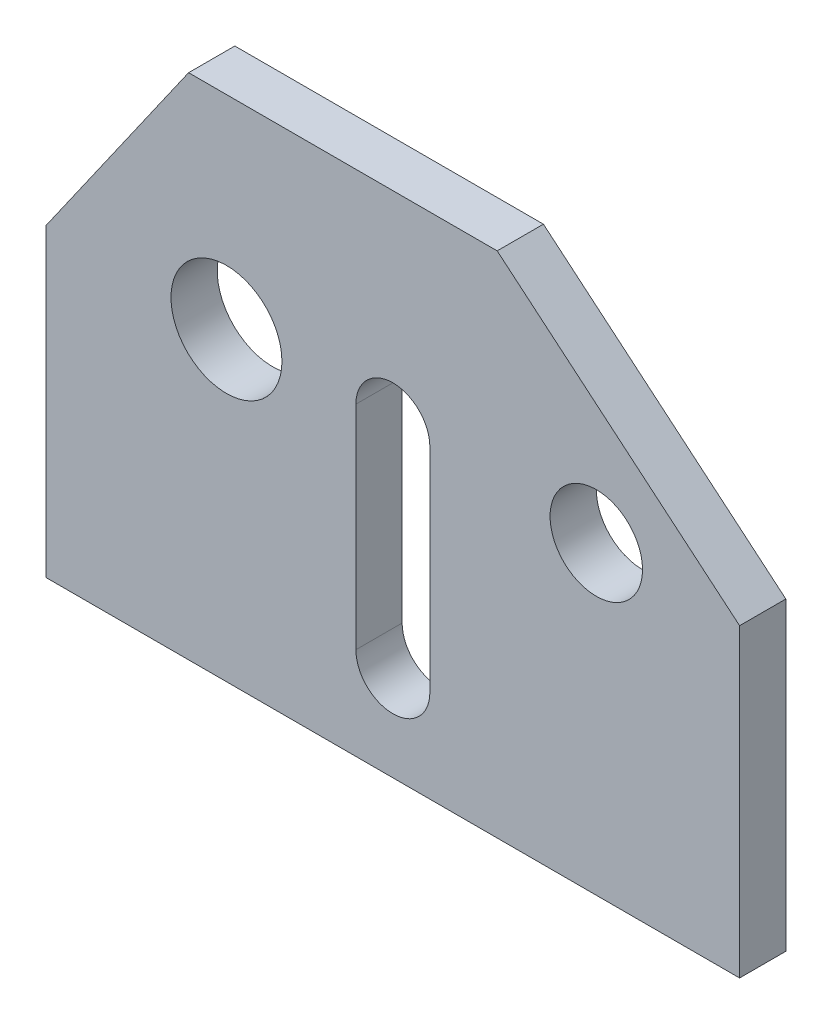
ISO-10303-21;
HEADER;
FILE_DESCRIPTION(('STEP AP214'),'2;1');
FILE_NAME('part.step','',(''),(''),'','','');
FILE_SCHEMA(('AUTOMOTIVE_DESIGN { 1 0 10303 214 1 1 1 1 }'));
ENDSEC;
DATA;
#1=APPLICATION_CONTEXT('core data for automotive mechanical design processes');
#2=APPLICATION_PROTOCOL_DEFINITION('international standard','automotive_design',2000,#1);
#3=PRODUCT_CONTEXT('',#1,'mechanical');
#4=PRODUCT('Part','Part','',(#3));
#5=PRODUCT_RELATED_PRODUCT_CATEGORY('part','',(#4));
#6=PRODUCT_DEFINITION_FORMATION('','',#4);
#7=PRODUCT_DEFINITION_CONTEXT('part definition',#1,'design');
#8=PRODUCT_DEFINITION('design','',#6,#7);
#9=PRODUCT_DEFINITION_SHAPE('','',#8);
#10=(LENGTH_UNIT() NAMED_UNIT(*) SI_UNIT(.MILLI.,.METRE.));
#11=(NAMED_UNIT(*) PLANE_ANGLE_UNIT() SI_UNIT($,.RADIAN.));
#12=(NAMED_UNIT(*) SI_UNIT($,.STERADIAN.) SOLID_ANGLE_UNIT());
#13=UNCERTAINTY_MEASURE_WITH_UNIT(LENGTH_MEASURE(1.E-05),#10,'distance_accuracy_value','');
#14=(GEOMETRIC_REPRESENTATION_CONTEXT(3) GLOBAL_UNCERTAINTY_ASSIGNED_CONTEXT((#13)) GLOBAL_UNIT_ASSIGNED_CONTEXT((#10,
#11,#12)) REPRESENTATION_CONTEXT('',''));
#15=CARTESIAN_POINT('',(0.,0.,0.));
#16=DIRECTION('',(0.,0.,1.));
#17=DIRECTION('',(1.,0.,0.));
#18=AXIS2_PLACEMENT_3D('',#15,#16,#17);
#19=CARTESIAN_POINT('',(0.,0.,5.));
#20=DIRECTION('',(0.,0.,1.));
#21=DIRECTION('',(1.,0.,0.));
#22=AXIS2_PLACEMENT_3D('',#19,#20,#21);
#23=PLANE('',#22);
#24=CARTESIAN_POINT('',(19.5,33.,5.));
#25=DIRECTION('',(0.,0.,1.));
#26=DIRECTION('',(1.,0.,0.));
#27=AXIS2_PLACEMENT_3D('',#24,#25,#26);
#28=CIRCLE('',#27,6.);
#29=CARTESIAN_POINT('',(25.5,33.,5.));
#30=VERTEX_POINT('',#29);
#31=EDGE_CURVE('E149',#30,#30,#28,.T.);
#32=ORIENTED_EDGE('',*,*,#31,.F.);
#33=EDGE_LOOP('',(#32));
#34=FACE_BOUND('',#33,.T.);
#35=DIRECTION('',(0.,-1.,0.));
#36=VECTOR('',#35,1.);
#37=CARTESIAN_POINT('',(0.,33.,5.));
#38=LINE('',#37,#36);
#39=CARTESIAN_POINT('',(0.,33.,5.));
#40=VERTEX_POINT('',#39);
#41=CARTESIAN_POINT('',(0.,0.,5.));
#42=VERTEX_POINT('',#41);
#43=EDGE_CURVE('E159',#40,#42,#38,.T.);
#44=ORIENTED_EDGE('',*,*,#43,.T.);
#45=DIRECTION('',(1.,0.,0.));
#46=VECTOR('',#45,1.);
#47=CARTESIAN_POINT('',(0.,0.,5.));
#48=LINE('',#47,#46);
#49=CARTESIAN_POINT('',(75.,0.,5.));
#50=VERTEX_POINT('',#49);
#51=EDGE_CURVE('E162',#42,#50,#48,.T.);
#52=ORIENTED_EDGE('',*,*,#51,.T.);
#53=DIRECTION('',(0.,1.,0.));
#54=VECTOR('',#53,1.);
#55=CARTESIAN_POINT('',(75.,0.,5.));
#56=LINE('',#55,#54);
#57=CARTESIAN_POINT('',(75.,33.,5.));
#58=VERTEX_POINT('',#57);
#59=EDGE_CURVE('E165',#50,#58,#56,.T.);
#60=ORIENTED_EDGE('',*,*,#59,.T.);
#61=DIRECTION('',(-0.766044443118979,0.642787609686538,0.));
#62=VECTOR('',#61,1.);
#63=CARTESIAN_POINT('',(75.,33.,5.));
#64=LINE('',#63,#62);
#65=CARTESIAN_POINT('',(48.7814209629273,55.,5.));
#66=VERTEX_POINT('',#65);
#67=EDGE_CURVE('E167',#58,#66,#64,.T.);
#68=ORIENTED_EDGE('',*,*,#67,.T.);
#69=DIRECTION('',(-1.,0.,0.));
#70=VECTOR('',#69,1.);
#71=CARTESIAN_POINT('',(48.7814209629273,55.,5.));
#72=LINE('',#71,#70);
#73=CARTESIAN_POINT('',(15.4045658406134,55.,5.));
#74=VERTEX_POINT('',#73);
#75=EDGE_CURVE('E169',#66,#74,#72,.T.);
#76=ORIENTED_EDGE('',*,*,#75,.T.);
#77=DIRECTION('',(-0.573576436351041,-0.819152044288995,0.));
#78=VECTOR('',#77,1.);
#79=CARTESIAN_POINT('',(15.4045658406134,55.,5.));
#80=LINE('',#79,#78);
#81=EDGE_CURVE('E171',#74,#40,#80,.T.);
#82=ORIENTED_EDGE('',*,*,#81,.T.);
#83=EDGE_LOOP('',(#44,#52,#60,#68,#76,#82));
#84=FACE_BOUND('',#83,.T.);
#85=DIRECTION('',(0.,-1.,0.));
#86=VECTOR('',#85,1.);
#87=CARTESIAN_POINT('',(33.5,33.,5.));
#88=LINE('',#87,#86);
#89=CARTESIAN_POINT('',(33.5,33.,5.));
#90=VERTEX_POINT('',#89);
#91=CARTESIAN_POINT('',(33.5,10.,5.));
#92=VERTEX_POINT('',#91);
#93=EDGE_CURVE('E128',#90,#92,#88,.T.);
#94=ORIENTED_EDGE('',*,*,#93,.F.);
#95=CARTESIAN_POINT('',(37.5,33.,5.));
#96=DIRECTION('',(0.,0.,1.));
#97=DIRECTION('',(1.,0.,0.));
#98=AXIS2_PLACEMENT_3D('',#95,#96,#97);
#99=CIRCLE('',#98,4.);
#100=CARTESIAN_POINT('',(41.5,33.,5.));
#101=VERTEX_POINT('',#100);
#102=EDGE_CURVE('E120',#101,#90,#99,.T.);
#103=ORIENTED_EDGE('',*,*,#102,.F.);
#104=DIRECTION('',(0.,1.,0.));
#105=VECTOR('',#104,1.);
#106=CARTESIAN_POINT('',(41.5,10.,5.));
#107=LINE('',#106,#105);
#108=CARTESIAN_POINT('',(41.5,10.,5.));
#109=VERTEX_POINT('',#108);
#110=EDGE_CURVE('E143',#109,#101,#107,.T.);
#111=ORIENTED_EDGE('',*,*,#110,.F.);
#112=CARTESIAN_POINT('',(37.5,10.,5.));
#113=DIRECTION('',(0.,0.,1.));
#114=DIRECTION('',(1.,0.,0.));
#115=AXIS2_PLACEMENT_3D('',#112,#113,#114);
#116=CIRCLE('',#115,4.);
#117=EDGE_CURVE('E141',#92,#109,#116,.T.);
#118=ORIENTED_EDGE('',*,*,#117,.F.);
#119=EDGE_LOOP('',(#94,#103,#111,#118));
#120=FACE_BOUND('',#119,.T.);
#121=CARTESIAN_POINT('',(59.5,33.,5.));
#122=DIRECTION('',(0.,0.,1.));
#123=DIRECTION('',(1.,0.,0.));
#124=AXIS2_PLACEMENT_3D('',#121,#122,#123);
#125=CIRCLE('',#124,4.99999999999998);
#126=CARTESIAN_POINT('',(64.5,33.,5.));
#127=VERTEX_POINT('',#126);
#128=EDGE_CURVE('E265',#127,#127,#125,.T.);
#129=ORIENTED_EDGE('',*,*,#128,.F.);
#130=EDGE_LOOP('',(#129));
#131=FACE_BOUND('',#130,.T.);
#132=ADVANCED_FACE('F43',(#34,#84,#120,#131),#23,.T.);
#133=CARTESIAN_POINT('',(0.,0.,0.));
#134=DIRECTION('',(0.,0.,1.));
#135=DIRECTION('',(1.,0.,0.));
#136=AXIS2_PLACEMENT_3D('',#133,#134,#135);
#137=PLANE('',#136);
#138=DIRECTION('',(0.,-1.,0.));
#139=VECTOR('',#138,1.);
#140=CARTESIAN_POINT('',(0.,33.,0.));
#141=LINE('',#140,#139);
#142=CARTESIAN_POINT('',(0.,33.,0.));
#143=VERTEX_POINT('',#142);
#144=CARTESIAN_POINT('',(0.,0.,0.));
#145=VERTEX_POINT('',#144);
#146=EDGE_CURVE('E136',#143,#145,#141,.T.);
#147=ORIENTED_EDGE('',*,*,#146,.F.);
#148=DIRECTION('',(-0.573576436351041,-0.819152044288995,0.));
#149=VECTOR('',#148,1.);
#150=CARTESIAN_POINT('',(15.4045658406134,55.,0.));
#151=LINE('',#150,#149);
#152=CARTESIAN_POINT('',(15.4045658406134,55.,0.));
#153=VERTEX_POINT('',#152);
#154=EDGE_CURVE('E163',#153,#143,#151,.T.);
#155=ORIENTED_EDGE('',*,*,#154,.F.);
#156=DIRECTION('',(-1.,0.,0.));
#157=VECTOR('',#156,1.);
#158=CARTESIAN_POINT('',(48.7814209629273,55.,0.));
#159=LINE('',#158,#157);
#160=CARTESIAN_POINT('',(48.7814209629273,55.,0.));
#161=VERTEX_POINT('',#160);
#162=EDGE_CURVE('E182',#161,#153,#159,.T.);
#163=ORIENTED_EDGE('',*,*,#162,.F.);
#164=DIRECTION('',(-0.766044443118979,0.642787609686538,0.));
#165=VECTOR('',#164,1.);
#166=CARTESIAN_POINT('',(75.,33.,0.));
#167=LINE('',#166,#165);
#168=CARTESIAN_POINT('',(75.,33.,0.));
#169=VERTEX_POINT('',#168);
#170=EDGE_CURVE('E180',#169,#161,#167,.T.);
#171=ORIENTED_EDGE('',*,*,#170,.F.);
#172=DIRECTION('',(0.,1.,0.));
#173=VECTOR('',#172,1.);
#174=CARTESIAN_POINT('',(75.,0.,0.));
#175=LINE('',#174,#173);
#176=CARTESIAN_POINT('',(75.,0.,0.));
#177=VERTEX_POINT('',#176);
#178=EDGE_CURVE('E178',#177,#169,#175,.T.);
#179=ORIENTED_EDGE('',*,*,#178,.F.);
#180=DIRECTION('',(1.,0.,0.));
#181=VECTOR('',#180,1.);
#182=CARTESIAN_POINT('',(0.,0.,0.));
#183=LINE('',#182,#181);
#184=EDGE_CURVE('E176',#145,#177,#183,.T.);
#185=ORIENTED_EDGE('',*,*,#184,.F.);
#186=EDGE_LOOP('',(#147,#155,#163,#171,#179,#185));
#187=FACE_BOUND('',#186,.T.);
#188=CARTESIAN_POINT('',(37.5,33.,0.));
#189=DIRECTION('',(0.,0.,1.));
#190=DIRECTION('',(1.,0.,0.));
#191=AXIS2_PLACEMENT_3D('',#188,#189,#190);
#192=CIRCLE('',#191,4.);
#193=CARTESIAN_POINT('',(41.5,33.,0.));
#194=VERTEX_POINT('',#193);
#195=CARTESIAN_POINT('',(33.5,33.,0.));
#196=VERTEX_POINT('',#195);
#197=EDGE_CURVE('E66',#194,#196,#192,.T.);
#198=ORIENTED_EDGE('',*,*,#197,.T.);
#199=DIRECTION('',(0.,-1.,0.));
#200=VECTOR('',#199,1.);
#201=CARTESIAN_POINT('',(33.5,33.,0.));
#202=LINE('',#201,#200);
#203=CARTESIAN_POINT('',(33.5,10.,0.));
#204=VERTEX_POINT('',#203);
#205=EDGE_CURVE('E135',#196,#204,#202,.T.);
#206=ORIENTED_EDGE('',*,*,#205,.T.);
#207=CARTESIAN_POINT('',(37.5,10.,0.));
#208=DIRECTION('',(0.,0.,1.));
#209=DIRECTION('',(1.,0.,0.));
#210=AXIS2_PLACEMENT_3D('',#207,#208,#209);
#211=CIRCLE('',#210,4.);
#212=CARTESIAN_POINT('',(41.5,10.,0.));
#213=VERTEX_POINT('',#212);
#214=EDGE_CURVE('E151',#204,#213,#211,.T.);
#215=ORIENTED_EDGE('',*,*,#214,.T.);
#216=DIRECTION('',(0.,1.,0.));
#217=VECTOR('',#216,1.);
#218=CARTESIAN_POINT('',(41.5,10.,0.));
#219=LINE('',#218,#217);
#220=EDGE_CURVE('E129',#213,#194,#219,.T.);
#221=ORIENTED_EDGE('',*,*,#220,.T.);
#222=EDGE_LOOP('',(#198,#206,#215,#221));
#223=FACE_BOUND('',#222,.T.);
#224=CARTESIAN_POINT('',(19.5,33.,0.));
#225=DIRECTION('',(0.,0.,1.));
#226=DIRECTION('',(1.,0.,0.));
#227=AXIS2_PLACEMENT_3D('',#224,#225,#226);
#228=CIRCLE('',#227,6.);
#229=CARTESIAN_POINT('',(25.5,33.,0.));
#230=VERTEX_POINT('',#229);
#231=EDGE_CURVE('E271',#230,#230,#228,.T.);
#232=ORIENTED_EDGE('',*,*,#231,.T.);
#233=EDGE_LOOP('',(#232));
#234=FACE_BOUND('',#233,.T.);
#235=CARTESIAN_POINT('',(59.5,33.,0.));
#236=DIRECTION('',(0.,0.,1.));
#237=DIRECTION('',(1.,0.,0.));
#238=AXIS2_PLACEMENT_3D('',#235,#236,#237);
#239=CIRCLE('',#238,4.99999999999998);
#240=CARTESIAN_POINT('',(64.5,33.,0.));
#241=VERTEX_POINT('',#240);
#242=EDGE_CURVE('E268',#241,#241,#239,.T.);
#243=ORIENTED_EDGE('',*,*,#242,.T.);
#244=EDGE_LOOP('',(#243));
#245=FACE_BOUND('',#244,.T.);
#246=ADVANCED_FACE('F206',(#187,#223,#234,#245),#137,.F.);
#247=CARTESIAN_POINT('',(0.,33.,5.));
#248=DIRECTION('',(1.,0.,0.));
#249=DIRECTION('',(0.,0.,-1.));
#250=AXIS2_PLACEMENT_3D('',#247,#248,#249);
#251=PLANE('',#250);
#252=ORIENTED_EDGE('',*,*,#146,.T.);
#253=DIRECTION('',(0.,0.,-1.));
#254=VECTOR('',#253,1.);
#255=CARTESIAN_POINT('',(0.,0.,5.));
#256=LINE('',#255,#254);
#257=EDGE_CURVE('E11',#42,#145,#256,.T.);
#258=ORIENTED_EDGE('',*,*,#257,.F.);
#259=ORIENTED_EDGE('',*,*,#43,.F.);
#260=DIRECTION('',(0.,0.,-1.));
#261=VECTOR('',#260,1.);
#262=CARTESIAN_POINT('',(0.,33.,5.));
#263=LINE('',#262,#261);
#264=EDGE_CURVE('E173',#40,#143,#263,.T.);
#265=ORIENTED_EDGE('',*,*,#264,.T.);
#266=EDGE_LOOP('',(#252,#258,#259,#265));
#267=FACE_BOUND('',#266,.T.);
#268=ADVANCED_FACE('F45',(#267),#251,.F.);
#269=CARTESIAN_POINT('',(0.,0.,5.));
#270=DIRECTION('',(0.,1.,0.));
#271=DIRECTION('',(0.,0.,1.));
#272=AXIS2_PLACEMENT_3D('',#269,#270,#271);
#273=PLANE('',#272);
#274=ORIENTED_EDGE('',*,*,#184,.T.);
#275=DIRECTION('',(0.,0.,-1.));
#276=VECTOR('',#275,1.);
#277=CARTESIAN_POINT('',(75.,0.,5.));
#278=LINE('',#277,#276);
#279=EDGE_CURVE('E51',#50,#177,#278,.T.);
#280=ORIENTED_EDGE('',*,*,#279,.F.);
#281=ORIENTED_EDGE('',*,*,#51,.F.);
#282=ORIENTED_EDGE('',*,*,#257,.T.);
#283=EDGE_LOOP('',(#274,#280,#281,#282));
#284=FACE_BOUND('',#283,.T.);
#285=ADVANCED_FACE('F223',(#284),#273,.F.);
#286=CARTESIAN_POINT('',(75.,0.,5.));
#287=DIRECTION('',(-1.,0.,0.));
#288=DIRECTION('',(0.,0.,1.));
#289=AXIS2_PLACEMENT_3D('',#286,#287,#288);
#290=PLANE('',#289);
#291=ORIENTED_EDGE('',*,*,#178,.T.);
#292=DIRECTION('',(0.,0.,-1.));
#293=VECTOR('',#292,1.);
#294=CARTESIAN_POINT('',(75.,33.,5.));
#295=LINE('',#294,#293);
#296=EDGE_CURVE('E193',#58,#169,#295,.T.);
#297=ORIENTED_EDGE('',*,*,#296,.F.);
#298=ORIENTED_EDGE('',*,*,#59,.F.);
#299=ORIENTED_EDGE('',*,*,#279,.T.);
#300=EDGE_LOOP('',(#291,#297,#298,#299));
#301=FACE_BOUND('',#300,.T.);
#302=ADVANCED_FACE('F200',(#301),#290,.F.);
#303=CARTESIAN_POINT('',(75.,33.,5.));
#304=DIRECTION('',(-0.642787609686538,-0.766044443118979,0.));
#305=DIRECTION('',(0.766044443118979,-0.642787609686538,0.));
#306=AXIS2_PLACEMENT_3D('',#303,#304,#305);
#307=PLANE('',#306);
#308=ORIENTED_EDGE('',*,*,#170,.T.);
#309=DIRECTION('',(0.,0.,-1.));
#310=VECTOR('',#309,1.);
#311=CARTESIAN_POINT('',(48.7814209629273,55.,5.));
#312=LINE('',#311,#310);
#313=EDGE_CURVE('E190',#66,#161,#312,.T.);
#314=ORIENTED_EDGE('',*,*,#313,.F.);
#315=ORIENTED_EDGE('',*,*,#67,.F.);
#316=ORIENTED_EDGE('',*,*,#296,.T.);
#317=EDGE_LOOP('',(#308,#314,#315,#316));
#318=FACE_BOUND('',#317,.T.);
#319=ADVANCED_FACE('F212',(#318),#307,.F.);
#320=CARTESIAN_POINT('',(48.7814209629273,55.,5.));
#321=DIRECTION('',(0.,-1.,0.));
#322=DIRECTION('',(1.,0.,0.));
#323=AXIS2_PLACEMENT_3D('',#320,#321,#322);
#324=PLANE('',#323);
#325=ORIENTED_EDGE('',*,*,#162,.T.);
#326=DIRECTION('',(0.,0.,-1.));
#327=VECTOR('',#326,1.);
#328=CARTESIAN_POINT('',(15.4045658406134,55.,5.));
#329=LINE('',#328,#327);
#330=EDGE_CURVE('E187',#74,#153,#329,.T.);
#331=ORIENTED_EDGE('',*,*,#330,.F.);
#332=ORIENTED_EDGE('',*,*,#75,.F.);
#333=ORIENTED_EDGE('',*,*,#313,.T.);
#334=EDGE_LOOP('',(#325,#331,#332,#333));
#335=FACE_BOUND('',#334,.T.);
#336=ADVANCED_FACE('F216',(#335),#324,.F.);
#337=CARTESIAN_POINT('',(15.4045658406134,55.,5.));
#338=DIRECTION('',(0.819152044288995,-0.573576436351041,0.));
#339=DIRECTION('',(0.573576436351041,0.819152044288995,0.));
#340=AXIS2_PLACEMENT_3D('',#337,#338,#339);
#341=PLANE('',#340);
#342=ORIENTED_EDGE('',*,*,#154,.T.);
#343=ORIENTED_EDGE('',*,*,#264,.F.);
#344=ORIENTED_EDGE('',*,*,#81,.F.);
#345=ORIENTED_EDGE('',*,*,#330,.T.);
#346=EDGE_LOOP('',(#342,#343,#344,#345));
#347=FACE_BOUND('',#346,.T.);
#348=ADVANCED_FACE('F226',(#347),#341,.F.);
#349=CARTESIAN_POINT('',(37.5,33.,5.));
#350=DIRECTION('',(0.,0.,-1.));
#351=DIRECTION('',(-1.,0.,0.));
#352=AXIS2_PLACEMENT_3D('',#349,#350,#351);
#353=CYLINDRICAL_SURFACE('',#352,4.);
#354=ORIENTED_EDGE('',*,*,#197,.F.);
#355=DIRECTION('',(0.,0.,-1.));
#356=VECTOR('',#355,1.);
#357=CARTESIAN_POINT('',(41.5,33.,5.));
#358=LINE('',#357,#356);
#359=EDGE_CURVE('E124',#101,#194,#358,.T.);
#360=ORIENTED_EDGE('',*,*,#359,.F.);
#361=ORIENTED_EDGE('',*,*,#102,.T.);
#362=DIRECTION('',(0.,0.,-1.));
#363=VECTOR('',#362,1.);
#364=CARTESIAN_POINT('',(33.5,33.,5.));
#365=LINE('',#364,#363);
#366=EDGE_CURVE('E123',#90,#196,#365,.T.);
#367=ORIENTED_EDGE('',*,*,#366,.T.);
#368=EDGE_LOOP('',(#354,#360,#361,#367));
#369=FACE_BOUND('',#368,.T.);
#370=ADVANCED_FACE('F122',(#369),#353,.F.);
#371=CARTESIAN_POINT('',(33.5,33.,5.));
#372=DIRECTION('',(1.,0.,0.));
#373=DIRECTION('',(0.,1.,0.));
#374=AXIS2_PLACEMENT_3D('',#371,#372,#373);
#375=PLANE('',#374);
#376=ORIENTED_EDGE('',*,*,#205,.F.);
#377=ORIENTED_EDGE('',*,*,#366,.F.);
#378=ORIENTED_EDGE('',*,*,#93,.T.);
#379=DIRECTION('',(0.,0.,-1.));
#380=VECTOR('',#379,1.);
#381=CARTESIAN_POINT('',(33.5,10.,5.));
#382=LINE('',#381,#380);
#383=EDGE_CURVE('E137',#92,#204,#382,.T.);
#384=ORIENTED_EDGE('',*,*,#383,.T.);
#385=EDGE_LOOP('',(#376,#377,#378,#384));
#386=FACE_BOUND('',#385,.T.);
#387=ADVANCED_FACE('F132',(#386),#375,.T.);
#388=CARTESIAN_POINT('',(37.5,10.,5.));
#389=DIRECTION('',(0.,0.,-1.));
#390=DIRECTION('',(-1.,0.,0.));
#391=AXIS2_PLACEMENT_3D('',#388,#389,#390);
#392=CYLINDRICAL_SURFACE('',#391,4.);
#393=ORIENTED_EDGE('',*,*,#214,.F.);
#394=ORIENTED_EDGE('',*,*,#383,.F.);
#395=ORIENTED_EDGE('',*,*,#117,.T.);
#396=DIRECTION('',(0.,0.,-1.));
#397=VECTOR('',#396,1.);
#398=CARTESIAN_POINT('',(41.5,10.,5.));
#399=LINE('',#398,#397);
#400=EDGE_CURVE('E58',#109,#213,#399,.T.);
#401=ORIENTED_EDGE('',*,*,#400,.T.);
#402=EDGE_LOOP('',(#393,#394,#395,#401));
#403=FACE_BOUND('',#402,.T.);
#404=ADVANCED_FACE('F246',(#403),#392,.F.);
#405=CARTESIAN_POINT('',(41.5,10.,5.));
#406=DIRECTION('',(-1.,0.,0.));
#407=DIRECTION('',(0.,-1.,0.));
#408=AXIS2_PLACEMENT_3D('',#405,#406,#407);
#409=PLANE('',#408);
#410=ORIENTED_EDGE('',*,*,#220,.F.);
#411=ORIENTED_EDGE('',*,*,#400,.F.);
#412=ORIENTED_EDGE('',*,*,#110,.T.);
#413=ORIENTED_EDGE('',*,*,#359,.T.);
#414=EDGE_LOOP('',(#410,#411,#412,#413));
#415=FACE_BOUND('',#414,.T.);
#416=ADVANCED_FACE('F249',(#415),#409,.T.);
#417=CARTESIAN_POINT('',(19.5,33.,5.));
#418=DIRECTION('',(0.,0.,-1.));
#419=DIRECTION('',(-1.,0.,0.));
#420=AXIS2_PLACEMENT_3D('',#417,#418,#419);
#421=CYLINDRICAL_SURFACE('',#420,6.);
#422=ORIENTED_EDGE('',*,*,#31,.T.);
#423=EDGE_LOOP('',(#422));
#424=FACE_BOUND('',#423,.T.);
#425=ORIENTED_EDGE('',*,*,#231,.F.);
#426=EDGE_LOOP('',(#425));
#427=FACE_BOUND('',#426,.T.);
#428=ADVANCED_FACE('F253',(#424,#427),#421,.F.);
#429=CARTESIAN_POINT('',(59.5,33.,5.));
#430=DIRECTION('',(0.,0.,-1.));
#431=DIRECTION('',(-1.,0.,0.));
#432=AXIS2_PLACEMENT_3D('',#429,#430,#431);
#433=CYLINDRICAL_SURFACE('',#432,4.99999999999998);
#434=ORIENTED_EDGE('',*,*,#128,.T.);
#435=EDGE_LOOP('',(#434));
#436=FACE_BOUND('',#435,.T.);
#437=ORIENTED_EDGE('',*,*,#242,.F.);
#438=EDGE_LOOP('',(#437));
#439=FACE_BOUND('',#438,.T.);
#440=ADVANCED_FACE('F256',(#436,#439),#433,.F.);
#441=CLOSED_SHELL('',(#132,#246,#268,#285,#302,#319,#336,#348,#370,#387,#404,#416,#428,#440));
#442=MANIFOLD_SOLID_BREP('B2',#441);
#443=ADVANCED_BREP_SHAPE_REPRESENTATION('',(#18,#442),#14);
#444=SHAPE_DEFINITION_REPRESENTATION(#9,#443);
ENDSEC;
END-ISO-10303-21;
